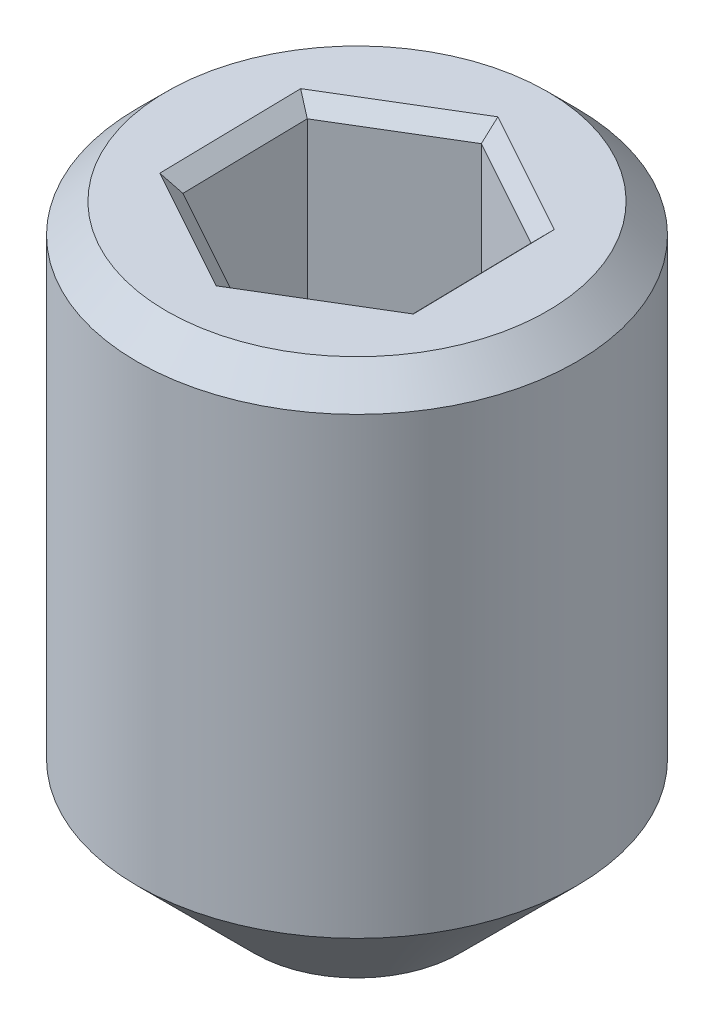
ISO-10303-21;
HEADER;
FILE_DESCRIPTION(('STEP AP214'),'2;1');
FILE_NAME('part.step','',(''),(''),'','','');
FILE_SCHEMA(('AUTOMOTIVE_DESIGN { 1 0 10303 214 1 1 1 1 }'));
ENDSEC;
DATA;
#1=APPLICATION_CONTEXT('core data for automotive mechanical design processes');
#2=APPLICATION_PROTOCOL_DEFINITION('international standard','automotive_design',2000,#1);
#3=PRODUCT_CONTEXT('',#1,'mechanical');
#4=PRODUCT('Part','Part','',(#3));
#5=PRODUCT_RELATED_PRODUCT_CATEGORY('part','',(#4));
#6=PRODUCT_DEFINITION_FORMATION('','',#4);
#7=PRODUCT_DEFINITION_CONTEXT('part definition',#1,'design');
#8=PRODUCT_DEFINITION('design','',#6,#7);
#9=PRODUCT_DEFINITION_SHAPE('','',#8);
#10=(LENGTH_UNIT() NAMED_UNIT(*) SI_UNIT(.MILLI.,.METRE.));
#11=(NAMED_UNIT(*) PLANE_ANGLE_UNIT() SI_UNIT($,.RADIAN.));
#12=(NAMED_UNIT(*) SI_UNIT($,.STERADIAN.) SOLID_ANGLE_UNIT());
#13=UNCERTAINTY_MEASURE_WITH_UNIT(LENGTH_MEASURE(1.E-05),#10,'distance_accuracy_value','');
#14=(GEOMETRIC_REPRESENTATION_CONTEXT(3) GLOBAL_UNCERTAINTY_ASSIGNED_CONTEXT((#13)) GLOBAL_UNIT_ASSIGNED_CONTEXT((#10,
#11,#12)) REPRESENTATION_CONTEXT('',''));
#15=CARTESIAN_POINT('',(0.,0.,0.));
#16=DIRECTION('',(0.,0.,1.));
#17=DIRECTION('',(1.,0.,0.));
#18=AXIS2_PLACEMENT_3D('',#15,#16,#17);
#19=CARTESIAN_POINT('',(0.,4.1,0.));
#20=DIRECTION('',(0.,-1.,0.));
#21=DIRECTION('',(0.,0.,-1.));
#22=AXIS2_PLACEMENT_3D('',#19,#20,#21);
#23=CYLINDRICAL_SURFACE('',#22,1.5);
#24=CARTESIAN_POINT('',(0.,0.799999999999999,0.));
#25=DIRECTION('',(0.,1.,0.));
#26=DIRECTION('',(0.,0.,1.));
#27=AXIS2_PLACEMENT_3D('',#24,#25,#26);
#28=CIRCLE('',#27,1.5);
#29=CARTESIAN_POINT('',(0.,0.799999999999999,1.5));
#30=VERTEX_POINT('',#29);
#31=EDGE_CURVE('E40',#30,#30,#28,.T.);
#32=ORIENTED_EDGE('',*,*,#31,.T.);
#33=EDGE_LOOP('',(#32));
#34=FACE_BOUND('',#33,.T.);
#35=CARTESIAN_POINT('',(0.,3.9,0.));
#36=DIRECTION('',(0.,1.,0.));
#37=DIRECTION('',(0.,0.,1.));
#38=AXIS2_PLACEMENT_3D('',#35,#36,#37);
#39=CIRCLE('',#38,1.5);
#40=CARTESIAN_POINT('',(0.,3.9,1.5));
#41=VERTEX_POINT('',#40);
#42=EDGE_CURVE('E161',#41,#41,#39,.F.);
#43=ORIENTED_EDGE('',*,*,#42,.T.);
#44=EDGE_LOOP('',(#43));
#45=FACE_BOUND('',#44,.T.);
#46=ADVANCED_FACE('F32',(#34,#45),#23,.T.);
#47=CARTESIAN_POINT('',(0.,4.1,0.));
#48=DIRECTION('',(0.,1.,0.));
#49=DIRECTION('',(0.,0.,1.));
#50=AXIS2_PLACEMENT_3D('',#47,#48,#49);
#51=PLANE('',#50);
#52=DIRECTION('',(-0.875489199042184,0.,-0.483237687231113));
#53=VECTOR('',#52,1.);
#54=CARTESIAN_POINT('',(-0.789849977701157,4.1,0.534917762581765));
#55=LINE('',#54,#53);
#56=CARTESIAN_POINT('',(0.018892301882227,4.1,0.981313616670493));
#57=VERTEX_POINT('',#56);
#58=CARTESIAN_POINT('',(-0.840396370175118,4.1,0.50701802170122));
#59=VERTEX_POINT('',#58);
#60=EDGE_CURVE('E175',#57,#59,#55,.T.);
#61=ORIENTED_EDGE('',*,*,#60,.T.);
#62=DIRECTION('',(-0.0192484863129093,0.,-0.999814730724979));
#63=VECTOR('',#62,1.);
#64=CARTESIAN_POINT('',(-0.85817736018192,4.1,-0.416571264576892));
#65=LINE('',#64,#63);
#66=CARTESIAN_POINT('',(-0.859288672057345,4.1,-0.474295594969274));
#67=VERTEX_POINT('',#66);
#68=EDGE_CURVE('E146',#59,#67,#65,.T.);
#69=ORIENTED_EDGE('',*,*,#68,.T.);
#70=DIRECTION('',(0.856240712729275,0.,-0.516577043493866));
#71=VECTOR('',#70,1.);
#72=CARTESIAN_POINT('',(-0.0683273824807632,4.1,-0.951489027158657));
#73=LINE('',#72,#71);
#74=CARTESIAN_POINT('',(-0.0188923018822269,4.1,-0.981313616670493));
#75=VERTEX_POINT('',#74);
#76=EDGE_CURVE('E160',#67,#75,#73,.T.);
#77=ORIENTED_EDGE('',*,*,#76,.T.);
#78=DIRECTION('',(0.875489199042184,0.,0.483237687231113));
#79=VECTOR('',#78,1.);
#80=CARTESIAN_POINT('',(0.789849977701157,4.1,-0.534917762581765));
#81=LINE('',#80,#79);
#82=CARTESIAN_POINT('',(0.840396370175118,4.1,-0.50701802170122));
#83=VERTEX_POINT('',#82);
#84=EDGE_CURVE('E163',#75,#83,#81,.T.);
#85=ORIENTED_EDGE('',*,*,#84,.T.);
#86=DIRECTION('',(0.0192484863129097,0.,0.999814730724979));
#87=VECTOR('',#86,1.);
#88=CARTESIAN_POINT('',(0.85817736018192,4.1,0.416571264576891));
#89=LINE('',#88,#87);
#90=CARTESIAN_POINT('',(0.859288672057346,4.1,0.474295594969273));
#91=VERTEX_POINT('',#90);
#92=EDGE_CURVE('E171',#83,#91,#89,.T.);
#93=ORIENTED_EDGE('',*,*,#92,.T.);
#94=DIRECTION('',(-0.856240712729275,0.,0.516577043493866));
#95=VECTOR('',#94,1.);
#96=CARTESIAN_POINT('',(0.0683273824807633,4.1,0.951489027158657));
#97=LINE('',#96,#95);
#98=EDGE_CURVE('E173',#91,#57,#97,.T.);
#99=ORIENTED_EDGE('',*,*,#98,.T.);
#100=EDGE_LOOP('',(#61,#69,#77,#85,#93,#99));
#101=FACE_BOUND('',#100,.T.);
#102=CARTESIAN_POINT('',(0.,4.1,0.));
#103=DIRECTION('',(0.,1.,0.));
#104=DIRECTION('',(0.,0.,1.));
#105=AXIS2_PLACEMENT_3D('',#102,#103,#104);
#106=CIRCLE('',#105,1.3);
#107=CARTESIAN_POINT('',(0.,4.1,1.3));
#108=VERTEX_POINT('',#107);
#109=EDGE_CURVE('E166',#108,#108,#106,.T.);
#110=ORIENTED_EDGE('',*,*,#109,.T.);
#111=EDGE_LOOP('',(#110));
#112=FACE_BOUND('',#111,.T.);
#113=ADVANCED_FACE('F252',(#101,#112),#51,.T.);
#114=CARTESIAN_POINT('',(0.,0.,0.));
#115=DIRECTION('',(0.,1.,0.));
#116=DIRECTION('',(0.,0.,1.));
#117=AXIS2_PLACEMENT_3D('',#114,#115,#116);
#118=PLANE('',#117);
#119=CARTESIAN_POINT('',(0.,0.,0.));
#120=DIRECTION('',(0.,1.,0.));
#121=DIRECTION('',(0.,0.,1.));
#122=AXIS2_PLACEMENT_3D('',#119,#120,#121);
#123=CIRCLE('',#122,0.699999999999997);
#124=CARTESIAN_POINT('',(0.,0.,0.699999999999997));
#125=VERTEX_POINT('',#124);
#126=EDGE_CURVE('E11',#125,#125,#123,.F.);
#127=ORIENTED_EDGE('',*,*,#126,.T.);
#128=EDGE_LOOP('',(#127));
#129=FACE_BOUND('',#128,.T.);
#130=ADVANCED_FACE('F257',(#129),#118,.F.);
#131=CARTESIAN_POINT('',(0.0166696781313767,2.1,0.865864955885729));
#132=DIRECTION('',(0.516577043493866,0.,0.856240712729275));
#133=DIRECTION('',(0.856240712729275,0.,-0.516577043493866));
#134=AXIS2_PLACEMENT_3D('',#131,#132,#133);
#135=PLANE('',#134);
#136=DIRECTION('',(0.,1.,0.));
#137=VECTOR('',#136,1.);
#138=CARTESIAN_POINT('',(0.758195887109423,2.1,0.418496113208182));
#139=LINE('',#138,#137);
#140=CARTESIAN_POINT('',(0.758195887109423,2.7,0.418496113208182));
#141=VERTEX_POINT('',#140);
#142=CARTESIAN_POINT('',(0.758195887109423,4.,0.418496113208182));
#143=VERTEX_POINT('',#142);
#144=EDGE_CURVE('E200',#141,#143,#139,.T.);
#145=ORIENTED_EDGE('',*,*,#144,.F.);
#146=DIRECTION('',(0.856240712729275,0.,-0.516577043493866));
#147=VECTOR('',#146,1.);
#148=CARTESIAN_POINT('',(0.0166696781313767,2.7,0.865864955885729));
#149=LINE('',#148,#147);
#150=CARTESIAN_POINT('',(0.0166696781313767,2.7,0.865864955885729));
#151=VERTEX_POINT('',#150);
#152=EDGE_CURVE('E216',#141,#151,#149,.F.);
#153=ORIENTED_EDGE('',*,*,#152,.T.);
#154=DIRECTION('',(0.,1.,0.));
#155=VECTOR('',#154,1.);
#156=CARTESIAN_POINT('',(0.0166696781313767,2.1,0.865864955885729));
#157=LINE('',#156,#155);
#158=CARTESIAN_POINT('',(0.0166696781313767,4.,0.865864955885729));
#159=VERTEX_POINT('',#158);
#160=EDGE_CURVE('E135',#151,#159,#157,.T.);
#161=ORIENTED_EDGE('',*,*,#160,.T.);
#162=DIRECTION('',(0.856240712729275,0.,-0.516577043493866));
#163=VECTOR('',#162,1.);
#164=CARTESIAN_POINT('',(0.758195887109423,4.,0.418496113208182));
#165=LINE('',#164,#163);
#166=EDGE_CURVE('E156',#159,#143,#165,.T.);
#167=ORIENTED_EDGE('',*,*,#166,.T.);
#168=EDGE_LOOP('',(#145,#153,#161,#167));
#169=FACE_BOUND('',#168,.T.);
#170=ADVANCED_FACE('F315',(#169),#135,.F.);
#171=CARTESIAN_POINT('',(-0.741526208978046,2.1,0.447368842677547));
#172=DIRECTION('',(-0.483237687231113,0.,0.875489199042184));
#173=DIRECTION('',(0.875489199042184,0.,0.483237687231113));
#174=AXIS2_PLACEMENT_3D('',#171,#172,#173);
#175=PLANE('',#174);
#176=ORIENTED_EDGE('',*,*,#160,.F.);
#177=DIRECTION('',(0.875489199042184,0.,0.483237687231113));
#178=VECTOR('',#177,1.);
#179=CARTESIAN_POINT('',(-0.741526208978046,2.7,0.447368842677547));
#180=LINE('',#179,#178);
#181=CARTESIAN_POINT('',(-0.741526208978046,2.7,0.447368842677547));
#182=VERTEX_POINT('',#181);
#183=EDGE_CURVE('E130',#151,#182,#180,.F.);
#184=ORIENTED_EDGE('',*,*,#183,.T.);
#185=DIRECTION('',(0.,1.,0.));
#186=VECTOR('',#185,1.);
#187=CARTESIAN_POINT('',(-0.741526208978046,2.1,0.447368842677547));
#188=LINE('',#187,#186);
#189=CARTESIAN_POINT('',(-0.741526208978046,4.,0.447368842677547));
#190=VERTEX_POINT('',#189);
#191=EDGE_CURVE('E122',#182,#190,#188,.T.);
#192=ORIENTED_EDGE('',*,*,#191,.T.);
#193=DIRECTION('',(0.875489199042184,0.,0.483237687231113));
#194=VECTOR('',#193,1.);
#195=CARTESIAN_POINT('',(0.0166696781313767,4.,0.865864955885729));
#196=LINE('',#195,#194);
#197=EDGE_CURVE('E127',#190,#159,#196,.T.);
#198=ORIENTED_EDGE('',*,*,#197,.T.);
#199=EDGE_LOOP('',(#176,#184,#192,#198));
#200=FACE_BOUND('',#199,.T.);
#201=ADVANCED_FACE('F125',(#200),#175,.F.);
#202=CARTESIAN_POINT('',(-0.758195887109422,2.1,-0.418496113208182));
#203=DIRECTION('',(-0.999814730724979,0.,0.0192484863129093));
#204=DIRECTION('',(0.0192484863129093,0.,0.999814730724979));
#205=AXIS2_PLACEMENT_3D('',#202,#203,#204);
#206=PLANE('',#205);
#207=ORIENTED_EDGE('',*,*,#191,.F.);
#208=DIRECTION('',(0.0192484863129093,0.,0.999814730724979));
#209=VECTOR('',#208,1.);
#210=CARTESIAN_POINT('',(-0.758195887109422,2.7,-0.418496113208182));
#211=LINE('',#210,#209);
#212=CARTESIAN_POINT('',(-0.758195887109422,2.7,-0.418496113208182));
#213=VERTEX_POINT('',#212);
#214=EDGE_CURVE('E213',#182,#213,#211,.F.);
#215=ORIENTED_EDGE('',*,*,#214,.T.);
#216=DIRECTION('',(0.,1.,0.));
#217=VECTOR('',#216,1.);
#218=CARTESIAN_POINT('',(-0.758195887109422,2.1,-0.418496113208182));
#219=LINE('',#218,#217);
#220=CARTESIAN_POINT('',(-0.758195887109422,4.,-0.418496113208182));
#221=VERTEX_POINT('',#220);
#222=EDGE_CURVE('E136',#213,#221,#219,.T.);
#223=ORIENTED_EDGE('',*,*,#222,.T.);
#224=DIRECTION('',(0.0192484863129093,0.,0.999814730724979));
#225=VECTOR('',#224,1.);
#226=CARTESIAN_POINT('',(-0.741526208978046,4.,0.447368842677547));
#227=LINE('',#226,#225);
#228=EDGE_CURVE('E144',#221,#190,#227,.T.);
#229=ORIENTED_EDGE('',*,*,#228,.T.);
#230=EDGE_LOOP('',(#207,#215,#223,#229));
#231=FACE_BOUND('',#230,.T.);
#232=ADVANCED_FACE('F158',(#231),#206,.F.);
#233=CARTESIAN_POINT('',(-0.0166696781313765,2.1,-0.865864955885729));
#234=DIRECTION('',(-0.516577043493866,0.,-0.856240712729275));
#235=DIRECTION('',(-0.856240712729275,0.,0.516577043493866));
#236=AXIS2_PLACEMENT_3D('',#233,#234,#235);
#237=PLANE('',#236);
#238=ORIENTED_EDGE('',*,*,#222,.F.);
#239=DIRECTION('',(-0.856240712729275,0.,0.516577043493866));
#240=VECTOR('',#239,1.);
#241=CARTESIAN_POINT('',(-0.0166696781313765,2.7,-0.865864955885729));
#242=LINE('',#241,#240);
#243=CARTESIAN_POINT('',(-0.0166696781313765,2.7,-0.865864955885729));
#244=VERTEX_POINT('',#243);
#245=EDGE_CURVE('E47',#213,#244,#242,.F.);
#246=ORIENTED_EDGE('',*,*,#245,.T.);
#247=DIRECTION('',(0.,1.,0.));
#248=VECTOR('',#247,1.);
#249=CARTESIAN_POINT('',(-0.0166696781313765,2.1,-0.865864955885729));
#250=LINE('',#249,#248);
#251=CARTESIAN_POINT('',(-0.0166696781313765,4.,-0.865864955885729));
#252=VERTEX_POINT('',#251);
#253=EDGE_CURVE('E320',#244,#252,#250,.T.);
#254=ORIENTED_EDGE('',*,*,#253,.T.);
#255=DIRECTION('',(-0.856240712729275,0.,0.516577043493866));
#256=VECTOR('',#255,1.);
#257=CARTESIAN_POINT('',(-0.758195887109422,4.,-0.418496113208182));
#258=LINE('',#257,#256);
#259=EDGE_CURVE('E186',#252,#221,#258,.T.);
#260=ORIENTED_EDGE('',*,*,#259,.T.);
#261=EDGE_LOOP('',(#238,#246,#254,#260));
#262=FACE_BOUND('',#261,.T.);
#263=ADVANCED_FACE('F345',(#262),#237,.F.);
#264=CARTESIAN_POINT('',(0.741526208978046,2.1,-0.447368842677547));
#265=DIRECTION('',(0.483237687231113,0.,-0.875489199042184));
#266=DIRECTION('',(-0.875489199042184,0.,-0.483237687231113));
#267=AXIS2_PLACEMENT_3D('',#264,#265,#266);
#268=PLANE('',#267);
#269=ORIENTED_EDGE('',*,*,#253,.F.);
#270=DIRECTION('',(-0.875489199042184,0.,-0.483237687231113));
#271=VECTOR('',#270,1.);
#272=CARTESIAN_POINT('',(0.741526208978046,2.7,-0.447368842677547));
#273=LINE('',#272,#271);
#274=CARTESIAN_POINT('',(0.741526208978046,2.7,-0.447368842677547));
#275=VERTEX_POINT('',#274);
#276=EDGE_CURVE('E54',#244,#275,#273,.F.);
#277=ORIENTED_EDGE('',*,*,#276,.T.);
#278=DIRECTION('',(0.,1.,0.));
#279=VECTOR('',#278,1.);
#280=CARTESIAN_POINT('',(0.741526208978046,2.1,-0.447368842677547));
#281=LINE('',#280,#279);
#282=CARTESIAN_POINT('',(0.741526208978046,4.,-0.447368842677547));
#283=VERTEX_POINT('',#282);
#284=EDGE_CURVE('E322',#275,#283,#281,.T.);
#285=ORIENTED_EDGE('',*,*,#284,.T.);
#286=DIRECTION('',(-0.875489199042184,0.,-0.483237687231113));
#287=VECTOR('',#286,1.);
#288=CARTESIAN_POINT('',(-0.0166696781313765,4.,-0.865864955885729));
#289=LINE('',#288,#287);
#290=EDGE_CURVE('E183',#283,#252,#289,.T.);
#291=ORIENTED_EDGE('',*,*,#290,.T.);
#292=EDGE_LOOP('',(#269,#277,#285,#291));
#293=FACE_BOUND('',#292,.T.);
#294=ADVANCED_FACE('F336',(#293),#268,.F.);
#295=CARTESIAN_POINT('',(0.758195887109423,2.1,0.418496113208182));
#296=DIRECTION('',(0.999814730724979,0.,-0.0192484863129097));
#297=DIRECTION('',(-0.0192484863129097,0.,-0.999814730724979));
#298=AXIS2_PLACEMENT_3D('',#295,#296,#297);
#299=PLANE('',#298);
#300=ORIENTED_EDGE('',*,*,#284,.F.);
#301=DIRECTION('',(-0.0192484863129097,0.,-0.999814730724979));
#302=VECTOR('',#301,1.);
#303=CARTESIAN_POINT('',(0.758195887109423,2.7,0.418496113208182));
#304=LINE('',#303,#302);
#305=EDGE_CURVE('E218',#275,#141,#304,.F.);
#306=ORIENTED_EDGE('',*,*,#305,.T.);
#307=ORIENTED_EDGE('',*,*,#144,.T.);
#308=DIRECTION('',(-0.0192484863129097,0.,-0.999814730724979));
#309=VECTOR('',#308,1.);
#310=CARTESIAN_POINT('',(0.741526208978046,4.,-0.447368842677547));
#311=LINE('',#310,#309);
#312=EDGE_CURVE('E180',#143,#283,#311,.T.);
#313=ORIENTED_EDGE('',*,*,#312,.T.);
#314=EDGE_LOOP('',(#300,#306,#307,#313));
#315=FACE_BOUND('',#314,.T.);
#316=ADVANCED_FACE('F325',(#315),#299,.F.);
#317=CARTESIAN_POINT('',(0.758195887109423,2.1,0.418496113208182));
#318=DIRECTION('',(0.,1.,0.));
#319=DIRECTION('',(0.,0.,1.));
#320=AXIS2_PLACEMENT_3D('',#317,#318,#319);
#321=PLANE('',#320);
#322=DIRECTION('',(-0.856240712729275,0.,0.516577043493866));
#323=VECTOR('',#322,1.);
#324=CARTESIAN_POINT('',(0.293276547964943,2.1,-0.352120528248165));
#325=LINE('',#324,#323);
#326=CARTESIAN_POINT('',(-0.00333393562627531,2.1,-0.173172991177146));
#327=VERTEX_POINT('',#326);
#328=CARTESIAN_POINT('',(-0.151639177421885,2.1,-0.0836992226416365));
#329=VERTEX_POINT('',#328);
#330=EDGE_CURVE('E187',#327,#329,#325,.T.);
#331=ORIENTED_EDGE('',*,*,#330,.T.);
#332=DIRECTION('',(0.0192484863129093,0.,0.999814730724979));
#333=VECTOR('',#332,1.);
#334=CARTESIAN_POINT('',(-0.141637370543058,2.1,0.435819750889801));
#335=LINE('',#334,#333);
#336=CARTESIAN_POINT('',(-0.148305241795609,2.1,0.0894737685355091));
#337=VERTEX_POINT('',#336);
#338=EDGE_CURVE('E210',#329,#337,#335,.T.);
#339=ORIENTED_EDGE('',*,*,#338,.T.);
#340=DIRECTION('',(0.875489199042184,0.,0.483237687231113));
#341=VECTOR('',#340,1.);
#342=CARTESIAN_POINT('',(0.685710234024756,2.1,0.54981949306451));
#343=LINE('',#342,#341);
#344=CARTESIAN_POINT('',(0.00333393562627543,2.1,0.173172991177146));
#345=VERTEX_POINT('',#344);
#346=EDGE_CURVE('E208',#337,#345,#343,.T.);
#347=ORIENTED_EDGE('',*,*,#346,.T.);
#348=DIRECTION('',(0.856240712729275,0.,-0.516577043493866));
#349=VECTOR('',#348,1.);
#350=CARTESIAN_POINT('',(0.448249661013103,2.1,-0.0952483144293826));
#351=LINE('',#350,#349);
#352=CARTESIAN_POINT('',(0.151639177421885,2.1,0.0836992226416362));
#353=VERTEX_POINT('',#352);
#354=EDGE_CURVE('E206',#345,#353,#351,.T.);
#355=ORIENTED_EDGE('',*,*,#354,.T.);
#356=DIRECTION('',(-0.0192484863129097,0.,-0.999814730724979));
#357=VECTOR('',#356,1.);
#358=CARTESIAN_POINT('',(0.158307048674435,2.1,0.430045204995928));
#359=LINE('',#358,#357);
#360=CARTESIAN_POINT('',(0.148305241795609,2.1,-0.0894737685355093));
#361=VERTEX_POINT('',#360);
#362=EDGE_CURVE('E204',#353,#361,#359,.T.);
#363=ORIENTED_EDGE('',*,*,#362,.T.);
#364=DIRECTION('',(-0.875489199042184,0.,-0.483237687231113));
#365=VECTOR('',#364,1.);
#366=CARTESIAN_POINT('',(0.830681540194089,2.1,0.287172733351855));
#367=LINE('',#366,#365);
#368=EDGE_CURVE('E202',#361,#327,#367,.T.);
#369=ORIENTED_EDGE('',*,*,#368,.T.);
#370=EDGE_LOOP('',(#331,#339,#347,#355,#363,#369));
#371=FACE_BOUND('',#370,.T.);
#372=ADVANCED_FACE('F266',(#371),#321,.T.);
#373=CARTESIAN_POINT('',(0.,4.1,0.));
#374=DIRECTION('',(0.,-1.,0.));
#375=DIRECTION('',(0.,0.,-1.));
#376=AXIS2_PLACEMENT_3D('',#373,#374,#375);
#377=CONICAL_SURFACE('',#376,1.3,0.785398163397443);
#378=ORIENTED_EDGE('',*,*,#42,.F.);
#379=EDGE_LOOP('',(#378));
#380=FACE_BOUND('',#379,.T.);
#381=ORIENTED_EDGE('',*,*,#109,.F.);
#382=EDGE_LOOP('',(#381));
#383=FACE_BOUND('',#382,.T.);
#384=ADVANCED_FACE('F262',(#380,#383),#377,.T.);
#385=CARTESIAN_POINT('',(0.758195887109423,4.,0.418496113208182));
#386=DIRECTION('',(-0.706975776025836,0.707106781186546,0.0136107351994349));
#387=DIRECTION('',(-0.707172286800526,-0.707041269503638,0.));
#388=AXIS2_PLACEMENT_3D('',#385,#386,#387);
#389=PLANE('',#388);
#390=DIRECTION('',(0.661807627482498,0.654653670707978,0.365293355585011));
#391=VECTOR('',#390,1.);
#392=CARTESIAN_POINT('',(0.541568490792446,3.78571428571429,0.298925795148702));
#393=LINE('',#392,#391);
#394=EDGE_CURVE('E194',#91,#143,#393,.F.);
#395=ORIENTED_EDGE('',*,*,#394,.F.);
#396=ORIENTED_EDGE('',*,*,#92,.F.);
#397=DIRECTION('',(0.647257139511529,0.654653670707978,-0.390495540025648));
#398=VECTOR('',#397,1.);
#399=CARTESIAN_POINT('',(0.529661577841462,3.78571428571428,-0.319549173341104));
#400=LINE('',#399,#398);
#401=EDGE_CURVE('E197',#283,#83,#400,.T.);
#402=ORIENTED_EDGE('',*,*,#401,.F.);
#403=ORIENTED_EDGE('',*,*,#312,.F.);
#404=EDGE_LOOP('',(#395,#396,#402,#403));
#405=FACE_BOUND('',#404,.T.);
#406=ADVANCED_FACE('F265',(#405),#389,.T.);
#407=CARTESIAN_POINT('',(0.741526208978046,4.,-0.447368842677547));
#408=DIRECTION('',(-0.341700645566024,0.707106781186547,0.619064349498308));
#409=DIRECTION('',(0.,-0.658713047341894,0.752394259189659));
#410=AXIS2_PLACEMENT_3D('',#407,#408,#409);
#411=PLANE('',#410);
#412=ORIENTED_EDGE('',*,*,#401,.T.);
#413=ORIENTED_EDGE('',*,*,#84,.F.);
#414=DIRECTION('',(-0.0145504879709682,0.654653670707978,-0.755788895610657));
#415=VECTOR('',#414,1.);
#416=CARTESIAN_POINT('',(-0.0119069129509834,3.78571428571429,-0.618474968489807));
#417=LINE('',#416,#415);
#418=EDGE_CURVE('E191',#252,#75,#417,.T.);
#419=ORIENTED_EDGE('',*,*,#418,.F.);
#420=ORIENTED_EDGE('',*,*,#290,.F.);
#421=EDGE_LOOP('',(#412,#413,#419,#420));
#422=FACE_BOUND('',#421,.T.);
#423=ADVANCED_FACE('F280',(#422),#411,.T.);
#424=CARTESIAN_POINT('',(0.0166696781313767,4.,0.865864955885729));
#425=DIRECTION('',(-0.365275130459811,0.707106781186547,-0.605453614298873));
#426=DIRECTION('',(0.,0.650396250554211,0.759595100869551));
#427=AXIS2_PLACEMENT_3D('',#424,#425,#426);
#428=PLANE('',#427);
#429=ORIENTED_EDGE('',*,*,#394,.T.);
#430=ORIENTED_EDGE('',*,*,#166,.F.);
#431=DIRECTION('',(0.0145504879709687,0.654653670707978,0.755788895610657));
#432=VECTOR('',#431,1.);
#433=CARTESIAN_POINT('',(0.0119069129509832,3.78571428571428,0.618474968489807));
#434=LINE('',#433,#432);
#435=EDGE_CURVE('E155',#57,#159,#434,.F.);
#436=ORIENTED_EDGE('',*,*,#435,.F.);
#437=ORIENTED_EDGE('',*,*,#98,.F.);
#438=EDGE_LOOP('',(#429,#430,#436,#437));
#439=FACE_BOUND('',#438,.T.);
#440=ADVANCED_FACE('F276',(#439),#428,.T.);
#441=CARTESIAN_POINT('',(-0.0166696781313765,4.,-0.865864955885729));
#442=DIRECTION('',(0.365275130459811,0.707106781186547,0.605453614298873));
#443=DIRECTION('',(0.,-0.650396250554211,0.759595100869551));
#444=AXIS2_PLACEMENT_3D('',#441,#442,#443);
#445=PLANE('',#444);
#446=ORIENTED_EDGE('',*,*,#418,.T.);
#447=ORIENTED_EDGE('',*,*,#76,.F.);
#448=DIRECTION('',(0.661807627482498,-0.654653670707978,0.36529335558501));
#449=VECTOR('',#448,1.);
#450=CARTESIAN_POINT('',(-0.758195887109422,4.,-0.418496113208183));
#451=LINE('',#450,#449);
#452=EDGE_CURVE('E149',#221,#67,#451,.F.);
#453=ORIENTED_EDGE('',*,*,#452,.F.);
#454=ORIENTED_EDGE('',*,*,#259,.F.);
#455=EDGE_LOOP('',(#446,#447,#453,#454));
#456=FACE_BOUND('',#455,.T.);
#457=ADVANCED_FACE('F273',(#456),#445,.T.);
#458=CARTESIAN_POINT('',(-0.741526208978046,4.,0.447368842677547));
#459=DIRECTION('',(0.341700645566024,0.707106781186547,-0.619064349498308));
#460=DIRECTION('',(0.,0.658713047341894,0.752394259189659));
#461=AXIS2_PLACEMENT_3D('',#458,#459,#460);
#462=PLANE('',#461);
#463=ORIENTED_EDGE('',*,*,#435,.T.);
#464=ORIENTED_EDGE('',*,*,#197,.F.);
#465=DIRECTION('',(-0.64725713951153,0.654653670707978,0.390495540025647));
#466=VECTOR('',#465,1.);
#467=CARTESIAN_POINT('',(-0.529661577841462,3.78571428571429,0.319549173341105));
#468=LINE('',#467,#466);
#469=EDGE_CURVE('E142',#59,#190,#468,.F.);
#470=ORIENTED_EDGE('',*,*,#469,.F.);
#471=ORIENTED_EDGE('',*,*,#60,.F.);
#472=EDGE_LOOP('',(#463,#464,#470,#471));
#473=FACE_BOUND('',#472,.T.);
#474=ADVANCED_FACE('F153',(#473),#462,.T.);
#475=CARTESIAN_POINT('',(-0.758195887109422,4.,-0.418496113208182));
#476=DIRECTION('',(0.706975776025835,0.707106781186547,-0.0136107351994347));
#477=DIRECTION('',(-0.707172286800526,0.707041269503637,0.));
#478=AXIS2_PLACEMENT_3D('',#475,#476,#477);
#479=PLANE('',#478);
#480=ORIENTED_EDGE('',*,*,#452,.T.);
#481=ORIENTED_EDGE('',*,*,#68,.F.);
#482=ORIENTED_EDGE('',*,*,#469,.T.);
#483=ORIENTED_EDGE('',*,*,#228,.F.);
#484=EDGE_LOOP('',(#480,#481,#482,#483));
#485=FACE_BOUND('',#484,.T.);
#486=ADVANCED_FACE('F143',(#485),#479,.T.);
#487=CARTESIAN_POINT('',(0.158307048674435,2.7,0.430045204995928));
#488=DIRECTION('',(-0.0192484863129097,0.,-0.999814730724979));
#489=DIRECTION('',(-0.999814730724979,0.,0.0192484863129097));
#490=AXIS2_PLACEMENT_3D('',#487,#488,#489);
#491=CYLINDRICAL_SURFACE('',#490,0.6);
#492=CARTESIAN_POINT('',(0.151639177421885,2.7,0.0836992226416362));
#493=DIRECTION('',(0.483237687231113,0.,-0.875489199042184));
#494=DIRECTION('',(0.875489199042184,0.,0.483237687231112));
#495=AXIS2_PLACEMENT_3D('',#492,#493,#494);
#496=ELLIPSE('',#495,0.692820323027551,0.6);
#497=EDGE_CURVE('E232',#141,#353,#496,.T.);
#498=ORIENTED_EDGE('',*,*,#497,.F.);
#499=ORIENTED_EDGE('',*,*,#305,.F.);
#500=CARTESIAN_POINT('',(0.148305241795609,2.7,-0.0894737685355093));
#501=DIRECTION('',(-0.516577043493866,0.,-0.856240712729275));
#502=DIRECTION('',(0.856240712729275,0.,-0.516577043493866));
#503=AXIS2_PLACEMENT_3D('',#500,#501,#502);
#504=ELLIPSE('',#503,0.692820323027551,0.6);
#505=EDGE_CURVE('E150',#361,#275,#504,.F.);
#506=ORIENTED_EDGE('',*,*,#505,.F.);
#507=ORIENTED_EDGE('',*,*,#362,.F.);
#508=EDGE_LOOP('',(#498,#499,#506,#507));
#509=FACE_BOUND('',#508,.T.);
#510=ADVANCED_FACE('F270',(#509),#491,.F.);
#511=CARTESIAN_POINT('',(0.830681540194089,2.7,0.287172733351855));
#512=DIRECTION('',(-0.875489199042184,0.,-0.483237687231113));
#513=DIRECTION('',(-0.483237687231113,0.,0.875489199042184));
#514=AXIS2_PLACEMENT_3D('',#511,#512,#513);
#515=CYLINDRICAL_SURFACE('',#514,0.6);
#516=ORIENTED_EDGE('',*,*,#505,.T.);
#517=ORIENTED_EDGE('',*,*,#276,.F.);
#518=CARTESIAN_POINT('',(-0.00333393562627522,2.7,-0.173172991177146));
#519=DIRECTION('',(-0.999814730724979,0.,0.0192484863129096));
#520=DIRECTION('',(-0.0192484863129094,0.,-0.999814730724979));
#521=AXIS2_PLACEMENT_3D('',#518,#519,#520);
#522=ELLIPSE('',#521,0.692820323027551,0.6);
#523=EDGE_CURVE('E229',#327,#244,#522,.F.);
#524=ORIENTED_EDGE('',*,*,#523,.F.);
#525=ORIENTED_EDGE('',*,*,#368,.F.);
#526=EDGE_LOOP('',(#516,#517,#524,#525));
#527=FACE_BOUND('',#526,.T.);
#528=ADVANCED_FACE('F298',(#527),#515,.F.);
#529=CARTESIAN_POINT('',(0.448249661013103,2.7,-0.0952483144293826));
#530=DIRECTION('',(0.856240712729275,0.,-0.516577043493866));
#531=DIRECTION('',(-0.516577043493866,0.,-0.856240712729275));
#532=AXIS2_PLACEMENT_3D('',#529,#530,#531);
#533=CYLINDRICAL_SURFACE('',#532,0.6);
#534=ORIENTED_EDGE('',*,*,#497,.T.);
#535=ORIENTED_EDGE('',*,*,#354,.F.);
#536=CARTESIAN_POINT('',(0.00333393562627557,2.7,0.173172991177146));
#537=DIRECTION('',(0.999814730724979,0.,-0.0192484863129096));
#538=DIRECTION('',(0.0192484863129097,0.,0.999814730724979));
#539=AXIS2_PLACEMENT_3D('',#536,#537,#538);
#540=ELLIPSE('',#539,0.692820323027551,0.6);
#541=EDGE_CURVE('E226',#151,#345,#540,.T.);
#542=ORIENTED_EDGE('',*,*,#541,.F.);
#543=ORIENTED_EDGE('',*,*,#152,.F.);
#544=EDGE_LOOP('',(#534,#535,#542,#543));
#545=FACE_BOUND('',#544,.T.);
#546=ADVANCED_FACE('F294',(#545),#533,.F.);
#547=CARTESIAN_POINT('',(0.293276547964943,2.7,-0.352120528248165));
#548=DIRECTION('',(-0.856240712729275,0.,0.516577043493866));
#549=DIRECTION('',(0.516577043493866,0.,0.856240712729275));
#550=AXIS2_PLACEMENT_3D('',#547,#548,#549);
#551=CYLINDRICAL_SURFACE('',#550,0.6);
#552=ORIENTED_EDGE('',*,*,#523,.T.);
#553=ORIENTED_EDGE('',*,*,#245,.F.);
#554=CARTESIAN_POINT('',(-0.151639177421885,2.7,-0.0836992226416363));
#555=DIRECTION('',(-0.483237687231113,0.,0.875489199042184));
#556=DIRECTION('',(0.875489199042184,0.,0.483237687231113));
#557=AXIS2_PLACEMENT_3D('',#554,#555,#556);
#558=ELLIPSE('',#557,0.692820323027551,0.6);
#559=EDGE_CURVE('E224',#329,#213,#558,.F.);
#560=ORIENTED_EDGE('',*,*,#559,.F.);
#561=ORIENTED_EDGE('',*,*,#330,.F.);
#562=EDGE_LOOP('',(#552,#553,#560,#561));
#563=FACE_BOUND('',#562,.T.);
#564=ADVANCED_FACE('F290',(#563),#551,.F.);
#565=CARTESIAN_POINT('',(0.685710234024756,2.7,0.54981949306451));
#566=DIRECTION('',(0.875489199042184,0.,0.483237687231113));
#567=DIRECTION('',(0.483237687231113,0.,-0.875489199042184));
#568=AXIS2_PLACEMENT_3D('',#565,#566,#567);
#569=CYLINDRICAL_SURFACE('',#568,0.6);
#570=ORIENTED_EDGE('',*,*,#541,.T.);
#571=ORIENTED_EDGE('',*,*,#346,.F.);
#572=CARTESIAN_POINT('',(-0.148305241795609,2.7,0.089473768535509));
#573=DIRECTION('',(0.516577043493866,0.,0.856240712729275));
#574=DIRECTION('',(-0.856240712729275,0.,0.516577043493866));
#575=AXIS2_PLACEMENT_3D('',#572,#573,#574);
#576=ELLIPSE('',#575,0.692820323027551,0.6);
#577=EDGE_CURVE('E222',#182,#337,#576,.T.);
#578=ORIENTED_EDGE('',*,*,#577,.F.);
#579=ORIENTED_EDGE('',*,*,#183,.F.);
#580=EDGE_LOOP('',(#570,#571,#578,#579));
#581=FACE_BOUND('',#580,.T.);
#582=ADVANCED_FACE('F247',(#581),#569,.F.);
#583=CARTESIAN_POINT('',(-0.141637370543059,2.7,0.435819750889801));
#584=DIRECTION('',(0.0192484863129093,0.,0.999814730724979));
#585=DIRECTION('',(0.999814730724979,0.,-0.0192484863129093));
#586=AXIS2_PLACEMENT_3D('',#583,#584,#585);
#587=CYLINDRICAL_SURFACE('',#586,0.6);
#588=ORIENTED_EDGE('',*,*,#559,.T.);
#589=ORIENTED_EDGE('',*,*,#214,.F.);
#590=ORIENTED_EDGE('',*,*,#577,.T.);
#591=ORIENTED_EDGE('',*,*,#338,.F.);
#592=EDGE_LOOP('',(#588,#589,#590,#591));
#593=FACE_BOUND('',#592,.T.);
#594=ADVANCED_FACE('F242',(#593),#587,.F.);
#595=CARTESIAN_POINT('',(0.,0.799999999999999,0.));
#596=DIRECTION('',(0.,1.,0.));
#597=DIRECTION('',(0.,0.,1.));
#598=AXIS2_PLACEMENT_3D('',#595,#596,#597);
#599=CONICAL_SURFACE('',#598,1.5,0.78539816339745);
#600=CARTESIAN_POINT('',(0.,0.,0.699999999999997));
#601=CARTESIAN_POINT('',(0.,0.00833333333333322,0.70833333333333));
#602=CARTESIAN_POINT('',(0.,0.0166666666666665,0.716666666666664));
#603=CARTESIAN_POINT('',(0.,0.0333333333333332,0.73333333333333));
#604=CARTESIAN_POINT('',(0.,0.0416666666666666,0.741666666666664));
#605=CARTESIAN_POINT('',(0.,0.0583333333333332,0.758333333333331));
#606=CARTESIAN_POINT('',(0.,0.0666666666666666,0.766666666666664));
#607=CARTESIAN_POINT('',(0.,0.0833333333333332,0.783333333333331));
#608=CARTESIAN_POINT('',(0.,0.0916666666666665,0.791666666666664));
#609=CARTESIAN_POINT('',(0.,0.108333333333333,0.80833333333333));
#610=CARTESIAN_POINT('',(0.,0.116666666666666,0.816666666666664));
#611=CARTESIAN_POINT('',(0.,0.133333333333333,0.833333333333331));
#612=CARTESIAN_POINT('',(0.,0.141666666666667,0.841666666666664));
#613=CARTESIAN_POINT('',(0.,0.158333333333333,0.858333333333331));
#614=CARTESIAN_POINT('',(0.,0.166666666666666,0.866666666666664));
#615=CARTESIAN_POINT('',(0.,0.183333333333333,0.883333333333331));
#616=CARTESIAN_POINT('',(0.,0.191666666666666,0.891666666666664));
#617=CARTESIAN_POINT('',(0.,0.208333333333333,0.908333333333331));
#618=CARTESIAN_POINT('',(0.,0.216666666666666,0.916666666666664));
#619=CARTESIAN_POINT('',(0.,0.233333333333333,0.933333333333331));
#620=CARTESIAN_POINT('',(0.,0.241666666666666,0.941666666666664));
#621=CARTESIAN_POINT('',(0.,0.258333333333333,0.958333333333331));
#622=CARTESIAN_POINT('',(0.,0.266666666666666,0.966666666666664));
#623=CARTESIAN_POINT('',(0.,0.283333333333333,0.983333333333331));
#624=CARTESIAN_POINT('',(0.,0.291666666666666,0.991666666666665));
#625=CARTESIAN_POINT('',(0.,0.308333333333333,1.00833333333333));
#626=CARTESIAN_POINT('',(0.,0.316666666666666,1.01666666666666));
#627=CARTESIAN_POINT('',(0.,0.333333333333333,1.03333333333333));
#628=CARTESIAN_POINT('',(0.,0.341666666666666,1.04166666666666));
#629=CARTESIAN_POINT('',(0.,0.358333333333333,1.05833333333333));
#630=CARTESIAN_POINT('',(0.,0.366666666666666,1.06666666666666));
#631=CARTESIAN_POINT('',(0.,0.383333333333333,1.08333333333333));
#632=CARTESIAN_POINT('',(0.,0.391666666666666,1.09166666666666));
#633=CARTESIAN_POINT('',(0.,0.408333333333333,1.10833333333333));
#634=CARTESIAN_POINT('',(0.,0.416666666666666,1.11666666666666));
#635=CARTESIAN_POINT('',(0.,0.433333333333333,1.13333333333333));
#636=CARTESIAN_POINT('',(0.,0.441666666666666,1.14166666666667));
#637=CARTESIAN_POINT('',(0.,0.458333333333333,1.15833333333333));
#638=CARTESIAN_POINT('',(0.,0.466666666666666,1.16666666666667));
#639=CARTESIAN_POINT('',(0.,0.483333333333333,1.18333333333333));
#640=CARTESIAN_POINT('',(0.,0.491666666666666,1.19166666666667));
#641=CARTESIAN_POINT('',(0.,0.508333333333333,1.20833333333333));
#642=CARTESIAN_POINT('',(0.,0.516666666666666,1.21666666666667));
#643=CARTESIAN_POINT('',(0.,0.533333333333333,1.23333333333333));
#644=CARTESIAN_POINT('',(0.,0.541666666666666,1.24166666666667));
#645=CARTESIAN_POINT('',(0.,0.558333333333333,1.25833333333333));
#646=CARTESIAN_POINT('',(0.,0.566666666666666,1.26666666666667));
#647=CARTESIAN_POINT('',(0.,0.583333333333333,1.28333333333333));
#648=CARTESIAN_POINT('',(0.,0.591666666666666,1.29166666666667));
#649=CARTESIAN_POINT('',(0.,0.608333333333333,1.30833333333333));
#650=CARTESIAN_POINT('',(0.,0.616666666666666,1.31666666666667));
#651=CARTESIAN_POINT('',(0.,0.633333333333333,1.33333333333333));
#652=CARTESIAN_POINT('',(0.,0.641666666666666,1.34166666666667));
#653=CARTESIAN_POINT('',(0.,0.658333333333333,1.35833333333333));
#654=CARTESIAN_POINT('',(0.,0.666666666666666,1.36666666666667));
#655=CARTESIAN_POINT('',(0.,0.683333333333333,1.38333333333333));
#656=CARTESIAN_POINT('',(0.,0.691666666666666,1.39166666666667));
#657=CARTESIAN_POINT('',(0.,0.708333333333333,1.40833333333333));
#658=CARTESIAN_POINT('',(0.,0.716666666666666,1.41666666666667));
#659=CARTESIAN_POINT('',(0.,0.733333333333333,1.43333333333333));
#660=CARTESIAN_POINT('',(0.,0.741666666666666,1.44166666666667));
#661=CARTESIAN_POINT('',(0.,0.758333333333333,1.45833333333333));
#662=CARTESIAN_POINT('',(0.,0.766666666666666,1.46666666666667));
#663=CARTESIAN_POINT('',(0.,0.783333333333333,1.48333333333333));
#664=CARTESIAN_POINT('',(0.,0.791666666666666,1.49166666666667));
#665=CARTESIAN_POINT('',(0.,0.799999999999999,1.5));
#666=B_SPLINE_CURVE_WITH_KNOTS('',3,(#600,#601,#602,#603,#604,#605,#606,#607,#608,#609,#610,
#611,#612,#613,#614,#615,#616,#617,#618,#619,#620,#621,#622,#623,#624,#625,#626,#627,#628,#629,
#630,#631,#632,#633,#634,#635,#636,#637,#638,#639,#640,#641,#642,#643,#644,#645,#646,#647,#648,
#649,#650,#651,#652,#653,#654,#655,#656,#657,#658,#659,#660,#661,#662,#663,#664,#665),
.UNSPECIFIED.,.F.,.F.,(4,2,2,2,2,2,2,2,2,2,2,2,2,2,2,2,2,2,2,2,2,2,2,2,2,2,2,2,2,2,2,2,4),(0.,
0.0353553390593274,0.0707106781186549,0.106066017177982,0.14142135623731,0.176776695296637,
0.212132034355965,0.247487373415292,0.282842712474619,0.318198051533947,0.353553390593274,
0.388908729652602,0.424264068711929,0.459619407771257,0.494974746830584,0.530330085889911,
0.565685424949239,0.601040764008566,0.636396103067894,0.671751442127221,0.707106781186549,
0.742462120245876,0.777817459305203,0.813172798364531,0.848528137423858,0.883883476483186,
0.919238815542513,0.95459415460184,0.989949493661168,1.0253048327205,1.06066017177982,
1.09601551083915,1.13137084989848),.UNSPECIFIED.);
#667=EDGE_CURVE('BSEAM34',#125,#30,#666,.T.);
#668=ORIENTED_EDGE('',*,*,#126,.F.);
#669=ORIENTED_EDGE('',*,*,#31,.F.);
#670=ORIENTED_EDGE('',*,*,#667,.T.);
#671=ORIENTED_EDGE('',*,*,#667,.F.);
#672=EDGE_LOOP('',(#668,#670,#669,#671));
#673=FACE_BOUND('',#672,.T.);
#674=ADVANCED_FACE('F34',(#673),#599,.T.);
#675=CLOSED_SHELL('',(#46,#113,#130,#170,#201,#232,#263,#294,#316,#372,#384,#406,#423,#440,#457,
#474,#486,#510,#528,#546,#564,#582,#594,#674));
#676=MANIFOLD_SOLID_BREP('B2',#675);
#677=ADVANCED_BREP_SHAPE_REPRESENTATION('',(#18,#676),#14);
#678=SHAPE_DEFINITION_REPRESENTATION(#9,#677);
ENDSEC;
END-ISO-10303-21;
